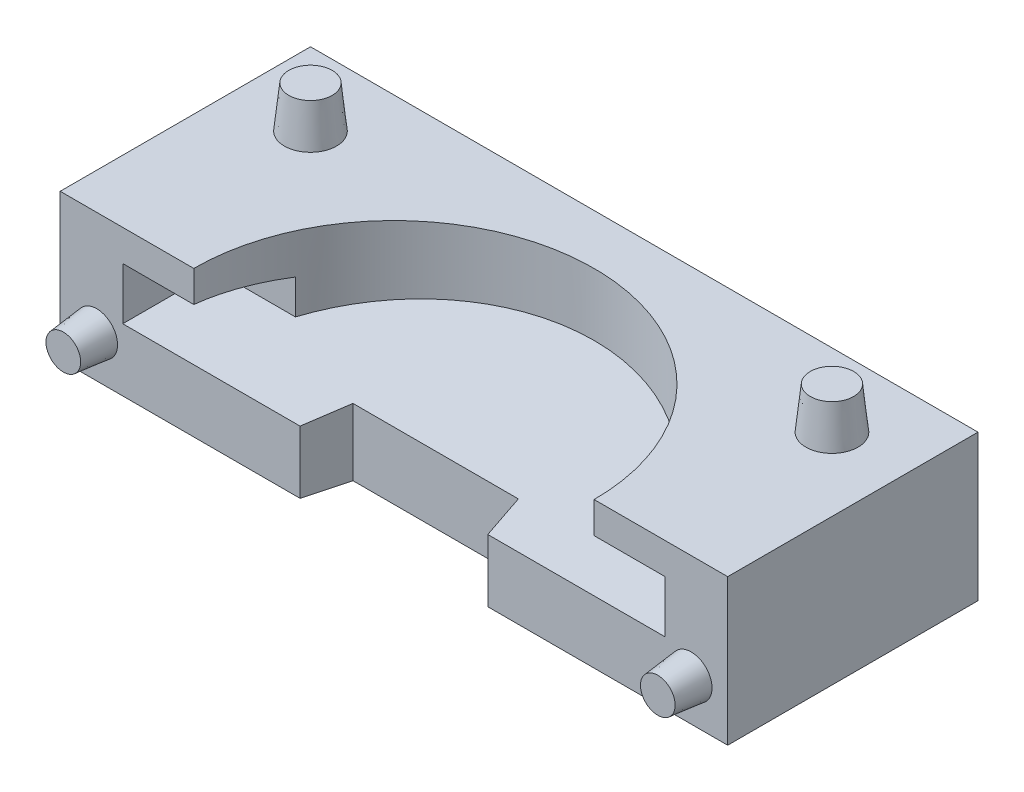
ISO-10303-21;
HEADER;
FILE_DESCRIPTION(('STEP AP214'),'2;1');
FILE_NAME('part.step','',(''),(''),'','','');
FILE_SCHEMA(('AUTOMOTIVE_DESIGN { 1 0 10303 214 1 1 1 1 }'));
ENDSEC;
DATA;
#1=APPLICATION_CONTEXT('core data for automotive mechanical design processes');
#2=APPLICATION_PROTOCOL_DEFINITION('international standard','automotive_design',2000,#1);
#3=PRODUCT_CONTEXT('',#1,'mechanical');
#4=PRODUCT('Part','Part','',(#3));
#5=PRODUCT_RELATED_PRODUCT_CATEGORY('part','',(#4));
#6=PRODUCT_DEFINITION_FORMATION('','',#4);
#7=PRODUCT_DEFINITION_CONTEXT('part definition',#1,'design');
#8=PRODUCT_DEFINITION('design','',#6,#7);
#9=PRODUCT_DEFINITION_SHAPE('','',#8);
#10=(LENGTH_UNIT() NAMED_UNIT(*) SI_UNIT(.MILLI.,.METRE.));
#11=(NAMED_UNIT(*) PLANE_ANGLE_UNIT() SI_UNIT($,.RADIAN.));
#12=(NAMED_UNIT(*) SI_UNIT($,.STERADIAN.) SOLID_ANGLE_UNIT());
#13=UNCERTAINTY_MEASURE_WITH_UNIT(LENGTH_MEASURE(1.E-05),#10,'distance_accuracy_value','');
#14=(GEOMETRIC_REPRESENTATION_CONTEXT(3) GLOBAL_UNCERTAINTY_ASSIGNED_CONTEXT((#13)) GLOBAL_UNIT_ASSIGNED_CONTEXT((#10,
#11,#12)) REPRESENTATION_CONTEXT('',''));
#15=CARTESIAN_POINT('',(0.,0.,0.));
#16=DIRECTION('',(0.,0.,1.));
#17=DIRECTION('',(1.,0.,0.));
#18=AXIS2_PLACEMENT_3D('',#15,#16,#17);
#19=CARTESIAN_POINT('',(0.,0.,0.));
#20=DIRECTION('',(0.,0.,-1.));
#21=DIRECTION('',(-1.,0.,0.));
#22=AXIS2_PLACEMENT_3D('',#19,#20,#21);
#23=PLANE('',#22);
#24=CARTESIAN_POINT('',(-142.5,-50.,0.));
#25=DIRECTION('',(0.,0.,-1.));
#26=DIRECTION('',(-1.,0.,0.));
#27=AXIS2_PLACEMENT_3D('',#24,#25,#26);
#28=CIRCLE('',#27,10.);
#29=CARTESIAN_POINT('',(-152.5,-50.,0.));
#30=VERTEX_POINT('',#29);
#31=EDGE_CURVE('E316',#30,#30,#28,.F.);
#32=ORIENTED_EDGE('',*,*,#31,.F.);
#33=EDGE_LOOP('',(#32));
#34=FACE_BOUND('',#33,.T.);
#35=DIRECTION('',(1.,0.,0.));
#36=VECTOR('',#35,1.);
#37=CARTESIAN_POINT('',(-160.,-70.,0.));
#38=LINE('',#37,#36);
#39=CARTESIAN_POINT('',(-160.,-70.,0.));
#40=VERTEX_POINT('',#39);
#41=CARTESIAN_POINT('',(-45.,-70.,0.));
#42=VERTEX_POINT('',#41);
#43=EDGE_CURVE('E261',#40,#42,#38,.T.);
#44=ORIENTED_EDGE('',*,*,#43,.T.);
#45=DIRECTION('',(0.,-1.,0.));
#46=VECTOR('',#45,1.);
#47=CARTESIAN_POINT('',(-45.,-35.7958305893729,0.));
#48=LINE('',#47,#46);
#49=CARTESIAN_POINT('',(-45.,-40.,0.));
#50=VERTEX_POINT('',#49);
#51=EDGE_CURVE('E177',#50,#42,#48,.T.);
#52=ORIENTED_EDGE('',*,*,#51,.F.);
#53=DIRECTION('',(1.,0.,0.));
#54=VECTOR('',#53,1.);
#55=CARTESIAN_POINT('',(-130.,-40.,0.));
#56=LINE('',#55,#54);
#57=CARTESIAN_POINT('',(-130.,-40.,0.));
#58=VERTEX_POINT('',#57);
#59=EDGE_CURVE('E304',#50,#58,#56,.F.);
#60=ORIENTED_EDGE('',*,*,#59,.T.);
#61=DIRECTION('',(0.,-1.,0.));
#62=VECTOR('',#61,1.);
#63=CARTESIAN_POINT('',(-130.,-15.,0.));
#64=LINE('',#63,#62);
#65=CARTESIAN_POINT('',(-130.,-15.,0.));
#66=VERTEX_POINT('',#65);
#67=EDGE_CURVE('E287',#66,#58,#64,.T.);
#68=ORIENTED_EDGE('',*,*,#67,.F.);
#69=DIRECTION('',(-1.,0.,0.));
#70=VECTOR('',#69,1.);
#71=CARTESIAN_POINT('',(-130.,-15.,0.));
#72=LINE('',#71,#70);
#73=CARTESIAN_POINT('',(-95.959595959596,-15.,0.));
#74=VERTEX_POINT('',#73);
#75=EDGE_CURVE('E284',#74,#66,#72,.T.);
#76=ORIENTED_EDGE('',*,*,#75,.F.);
#77=DIRECTION('',(0.,1.,0.));
#78=VECTOR('',#77,1.);
#79=CARTESIAN_POINT('',(-95.959595959596,-351.414724091806,0.));
#80=LINE('',#79,#78);
#81=CARTESIAN_POINT('',(-95.959595959596,0.,0.));
#82=VERTEX_POINT('',#81);
#83=EDGE_CURVE('E240',#74,#82,#80,.T.);
#84=ORIENTED_EDGE('',*,*,#83,.T.);
#85=DIRECTION('',(-1.,0.,0.));
#86=VECTOR('',#85,1.);
#87=CARTESIAN_POINT('',(-160.,0.,0.));
#88=LINE('',#87,#86);
#89=CARTESIAN_POINT('',(-160.,0.,0.));
#90=VERTEX_POINT('',#89);
#91=EDGE_CURVE('E243',#82,#90,#88,.T.);
#92=ORIENTED_EDGE('',*,*,#91,.T.);
#93=DIRECTION('',(0.,-1.,0.));
#94=VECTOR('',#93,1.);
#95=CARTESIAN_POINT('',(-160.,-70.,0.));
#96=LINE('',#95,#94);
#97=EDGE_CURVE('E264',#90,#40,#96,.T.);
#98=ORIENTED_EDGE('',*,*,#97,.T.);
#99=EDGE_LOOP('',(#44,#52,#60,#68,#76,#84,#92,#98));
#100=FACE_BOUND('',#99,.T.);
#101=ADVANCED_FACE('F37',(#34,#100),#23,.F.);
#102=CARTESIAN_POINT('',(-160.,0.,-120.));
#103=DIRECTION('',(0.,1.,0.));
#104=DIRECTION('',(-1.,0.,0.));
#105=AXIS2_PLACEMENT_3D('',#102,#103,#104);
#106=PLANE('',#105);
#107=CARTESIAN_POINT('',(125.,0.,-85.));
#108=DIRECTION('',(0.,1.,0.));
#109=DIRECTION('',(-1.,0.,0.));
#110=AXIS2_PLACEMENT_3D('',#107,#108,#109);
#111=CIRCLE('',#110,12.5);
#112=CARTESIAN_POINT('',(112.5,0.,-85.));
#113=VERTEX_POINT('',#112);
#114=EDGE_CURVE('E216',#113,#113,#111,.T.);
#115=ORIENTED_EDGE('',*,*,#114,.F.);
#116=EDGE_LOOP('',(#115));
#117=FACE_BOUND('',#116,.T.);
#118=CARTESIAN_POINT('',(-125.,0.,-85.));
#119=DIRECTION('',(0.,1.,0.));
#120=DIRECTION('',(-1.,0.,0.));
#121=AXIS2_PLACEMENT_3D('',#118,#119,#120);
#122=CIRCLE('',#121,12.5);
#123=CARTESIAN_POINT('',(-137.5,0.,-85.));
#124=VERTEX_POINT('',#123);
#125=EDGE_CURVE('E222',#124,#124,#122,.T.);
#126=ORIENTED_EDGE('',*,*,#125,.F.);
#127=EDGE_LOOP('',(#126));
#128=FACE_BOUND('',#127,.T.);
#129=CARTESIAN_POINT('',(0.,0.,0.));
#130=DIRECTION('',(0.,1.,0.));
#131=DIRECTION('',(0.,0.,1.));
#132=AXIS2_PLACEMENT_3D('',#129,#130,#131);
#133=CIRCLE('',#132,95.959595959596);
#134=CARTESIAN_POINT('',(95.959595959596,0.,0.));
#135=VERTEX_POINT('',#134);
#136=EDGE_CURVE('E307',#135,#82,#133,.T.);
#137=ORIENTED_EDGE('',*,*,#136,.F.);
#138=CARTESIAN_POINT('',(160.,0.,0.));
#139=VERTEX_POINT('',#138);
#140=EDGE_CURVE('E239',#139,#135,#88,.T.);
#141=ORIENTED_EDGE('',*,*,#140,.F.);
#142=DIRECTION('',(0.,0.,1.));
#143=VECTOR('',#142,1.);
#144=CARTESIAN_POINT('',(160.,0.,-120.));
#145=LINE('',#144,#143);
#146=CARTESIAN_POINT('',(160.,0.,-120.));
#147=VERTEX_POINT('',#146);
#148=EDGE_CURVE('E253',#147,#139,#145,.T.);
#149=ORIENTED_EDGE('',*,*,#148,.F.);
#150=DIRECTION('',(-1.,0.,0.));
#151=VECTOR('',#150,1.);
#152=CARTESIAN_POINT('',(-160.,0.,-120.));
#153=LINE('',#152,#151);
#154=CARTESIAN_POINT('',(-160.,0.,-120.));
#155=VERTEX_POINT('',#154);
#156=EDGE_CURVE('E234',#147,#155,#153,.T.);
#157=ORIENTED_EDGE('',*,*,#156,.T.);
#158=DIRECTION('',(0.,0.,1.));
#159=VECTOR('',#158,1.);
#160=CARTESIAN_POINT('',(-160.,0.,-120.));
#161=LINE('',#160,#159);
#162=EDGE_CURVE('E255',#155,#90,#161,.T.);
#163=ORIENTED_EDGE('',*,*,#162,.T.);
#164=ORIENTED_EDGE('',*,*,#91,.F.);
#165=EDGE_LOOP('',(#137,#141,#149,#157,#163,#164));
#166=FACE_BOUND('',#165,.T.);
#167=ADVANCED_FACE('F39',(#117,#128,#166),#106,.T.);
#168=CARTESIAN_POINT('',(142.5,-50.,0.));
#169=DIRECTION('',(0.,0.,-1.));
#170=DIRECTION('',(-1.,0.,0.));
#171=AXIS2_PLACEMENT_3D('',#168,#169,#170);
#172=CIRCLE('',#171,10.);
#173=CARTESIAN_POINT('',(132.5,-50.,0.));
#174=VERTEX_POINT('',#173);
#175=EDGE_CURVE('E328',#174,#174,#172,.F.);
#176=ORIENTED_EDGE('',*,*,#175,.F.);
#177=EDGE_LOOP('',(#176));
#178=FACE_BOUND('',#177,.T.);
#179=CARTESIAN_POINT('',(130.,-40.,0.));
#180=VERTEX_POINT('',#179);
#181=CARTESIAN_POINT('',(45.,-40.,0.));
#182=VERTEX_POINT('',#181);
#183=EDGE_CURVE('E244',#180,#182,#56,.F.);
#184=ORIENTED_EDGE('',*,*,#183,.T.);
#185=DIRECTION('',(0.,-1.,0.));
#186=VECTOR('',#185,1.);
#187=CARTESIAN_POINT('',(45.,-35.7958305893729,0.));
#188=LINE('',#187,#186);
#189=CARTESIAN_POINT('',(45.,-70.,0.));
#190=VERTEX_POINT('',#189);
#191=EDGE_CURVE('E189',#182,#190,#188,.T.);
#192=ORIENTED_EDGE('',*,*,#191,.T.);
#193=CARTESIAN_POINT('',(160.,-70.,0.));
#194=VERTEX_POINT('',#193);
#195=EDGE_CURVE('E263',#190,#194,#38,.T.);
#196=ORIENTED_EDGE('',*,*,#195,.T.);
#197=DIRECTION('',(0.,1.,0.));
#198=VECTOR('',#197,1.);
#199=CARTESIAN_POINT('',(160.,-70.,0.));
#200=LINE('',#199,#198);
#201=EDGE_CURVE('E258',#194,#139,#200,.T.);
#202=ORIENTED_EDGE('',*,*,#201,.T.);
#203=ORIENTED_EDGE('',*,*,#140,.T.);
#204=DIRECTION('',(0.,1.,0.));
#205=VECTOR('',#204,1.);
#206=CARTESIAN_POINT('',(95.959595959596,-351.414724091806,0.));
#207=LINE('',#206,#205);
#208=CARTESIAN_POINT('',(95.959595959596,-15.,0.));
#209=VERTEX_POINT('',#208);
#210=EDGE_CURVE('E235',#135,#209,#207,.F.);
#211=ORIENTED_EDGE('',*,*,#210,.T.);
#212=DIRECTION('',(-1.,0.,0.));
#213=VECTOR('',#212,1.);
#214=CARTESIAN_POINT('',(-130.,-15.,0.));
#215=LINE('',#214,#213);
#216=CARTESIAN_POINT('',(130.,-15.,0.));
#217=VERTEX_POINT('',#216);
#218=EDGE_CURVE('E300',#217,#209,#215,.T.);
#219=ORIENTED_EDGE('',*,*,#218,.F.);
#220=DIRECTION('',(0.,-1.,0.));
#221=VECTOR('',#220,1.);
#222=CARTESIAN_POINT('',(130.,-15.,0.));
#223=LINE('',#222,#221);
#224=EDGE_CURVE('E238',#217,#180,#223,.T.);
#225=ORIENTED_EDGE('',*,*,#224,.T.);
#226=EDGE_LOOP('',(#184,#192,#196,#202,#203,#211,#219,#225));
#227=FACE_BOUND('',#226,.T.);
#228=ADVANCED_FACE('F357',(#178,#227),#23,.F.);
#229=CARTESIAN_POINT('',(-160.,-70.,-120.));
#230=DIRECTION('',(-1.,0.,0.));
#231=DIRECTION('',(0.,0.,1.));
#232=AXIS2_PLACEMENT_3D('',#229,#230,#231);
#233=PLANE('',#232);
#234=ORIENTED_EDGE('',*,*,#97,.F.);
#235=ORIENTED_EDGE('',*,*,#162,.F.);
#236=DIRECTION('',(0.,-1.,0.));
#237=VECTOR('',#236,1.);
#238=CARTESIAN_POINT('',(-160.,-70.,-120.));
#239=LINE('',#238,#237);
#240=CARTESIAN_POINT('',(-160.,-70.,-120.));
#241=VERTEX_POINT('',#240);
#242=EDGE_CURVE('E248',#155,#241,#239,.T.);
#243=ORIENTED_EDGE('',*,*,#242,.T.);
#244=DIRECTION('',(0.,0.,1.));
#245=VECTOR('',#244,1.);
#246=CARTESIAN_POINT('',(-160.,-70.,-120.));
#247=LINE('',#246,#245);
#248=EDGE_CURVE('E245',#241,#40,#247,.T.);
#249=ORIENTED_EDGE('',*,*,#248,.T.);
#250=EDGE_LOOP('',(#234,#235,#243,#249));
#251=FACE_BOUND('',#250,.T.);
#252=ADVANCED_FACE('F348',(#251),#233,.T.);
#253=CARTESIAN_POINT('',(160.,-70.,-120.));
#254=DIRECTION('',(1.,0.,0.));
#255=DIRECTION('',(0.,0.,-1.));
#256=AXIS2_PLACEMENT_3D('',#253,#254,#255);
#257=PLANE('',#256);
#258=ORIENTED_EDGE('',*,*,#201,.F.);
#259=DIRECTION('',(0.,0.,1.));
#260=VECTOR('',#259,1.);
#261=CARTESIAN_POINT('',(160.,-70.,-120.));
#262=LINE('',#261,#260);
#263=CARTESIAN_POINT('',(160.,-70.,-120.));
#264=VERTEX_POINT('',#263);
#265=EDGE_CURVE('E249',#264,#194,#262,.T.);
#266=ORIENTED_EDGE('',*,*,#265,.F.);
#267=DIRECTION('',(0.,1.,0.));
#268=VECTOR('',#267,1.);
#269=CARTESIAN_POINT('',(160.,-70.,-120.));
#270=LINE('',#269,#268);
#271=EDGE_CURVE('E247',#264,#147,#270,.T.);
#272=ORIENTED_EDGE('',*,*,#271,.T.);
#273=ORIENTED_EDGE('',*,*,#148,.T.);
#274=EDGE_LOOP('',(#258,#266,#272,#273));
#275=FACE_BOUND('',#274,.T.);
#276=ADVANCED_FACE('F355',(#275),#257,.T.);
#277=CARTESIAN_POINT('',(-160.,-70.,-120.));
#278=DIRECTION('',(0.,-1.,0.));
#279=DIRECTION('',(1.,0.,0.));
#280=AXIS2_PLACEMENT_3D('',#277,#278,#279);
#281=PLANE('',#280);
#282=DIRECTION('',(0.258819045102514,0.,-0.96592582628907));
#283=VECTOR('',#282,1.);
#284=CARTESIAN_POINT('',(-39.6410161513777,-70.,-20.));
#285=LINE('',#284,#283);
#286=CARTESIAN_POINT('',(-39.6410161513777,-70.,-20.));
#287=VERTEX_POINT('',#286);
#288=EDGE_CURVE('E174',#42,#287,#285,.T.);
#289=ORIENTED_EDGE('',*,*,#288,.F.);
#290=ORIENTED_EDGE('',*,*,#43,.F.);
#291=ORIENTED_EDGE('',*,*,#248,.F.);
#292=DIRECTION('',(1.,0.,0.));
#293=VECTOR('',#292,1.);
#294=CARTESIAN_POINT('',(-160.,-70.,-120.));
#295=LINE('',#294,#293);
#296=EDGE_CURVE('E252',#241,#264,#295,.T.);
#297=ORIENTED_EDGE('',*,*,#296,.T.);
#298=ORIENTED_EDGE('',*,*,#265,.T.);
#299=ORIENTED_EDGE('',*,*,#195,.F.);
#300=DIRECTION('',(0.258819045102514,0.,0.96592582628907));
#301=VECTOR('',#300,1.);
#302=CARTESIAN_POINT('',(45.,-70.,0.));
#303=LINE('',#302,#301);
#304=CARTESIAN_POINT('',(39.6410161513777,-70.,-20.));
#305=VERTEX_POINT('',#304);
#306=EDGE_CURVE('E171',#305,#190,#303,.T.);
#307=ORIENTED_EDGE('',*,*,#306,.F.);
#308=DIRECTION('',(1.,0.,0.));
#309=VECTOR('',#308,1.);
#310=CARTESIAN_POINT('',(39.6410161513777,-70.,-20.));
#311=LINE('',#310,#309);
#312=EDGE_CURVE('E165',#287,#305,#311,.T.);
#313=ORIENTED_EDGE('',*,*,#312,.F.);
#314=EDGE_LOOP('',(#289,#290,#291,#297,#298,#299,#307,#313));
#315=FACE_BOUND('',#314,.T.);
#316=ADVANCED_FACE('F182',(#315),#281,.T.);
#317=CARTESIAN_POINT('',(0.,0.,-120.));
#318=DIRECTION('',(0.,0.,-1.));
#319=DIRECTION('',(-1.,0.,0.));
#320=AXIS2_PLACEMENT_3D('',#317,#318,#319);
#321=PLANE('',#320);
#322=CARTESIAN_POINT('',(112.5,-27.5,-120.));
#323=DIRECTION('',(0.,0.,1.));
#324=DIRECTION('',(1.,0.,0.));
#325=AXIS2_PLACEMENT_3D('',#322,#323,#324);
#326=CIRCLE('',#325,3.74999999999998);
#327=CARTESIAN_POINT('',(116.25,-27.5,-120.));
#328=VERTEX_POINT('',#327);
#329=EDGE_CURVE('E201',#328,#328,#326,.T.);
#330=ORIENTED_EDGE('',*,*,#329,.T.);
#331=EDGE_LOOP('',(#330));
#332=FACE_BOUND('',#331,.T.);
#333=CARTESIAN_POINT('',(-112.5,-27.5,-120.));
#334=DIRECTION('',(0.,0.,1.));
#335=DIRECTION('',(1.,0.,0.));
#336=AXIS2_PLACEMENT_3D('',#333,#334,#335);
#337=CIRCLE('',#336,3.74999999999998);
#338=CARTESIAN_POINT('',(-108.75,-27.5,-120.));
#339=VERTEX_POINT('',#338);
#340=EDGE_CURVE('E213',#339,#339,#337,.T.);
#341=ORIENTED_EDGE('',*,*,#340,.T.);
#342=EDGE_LOOP('',(#341));
#343=FACE_BOUND('',#342,.T.);
#344=ORIENTED_EDGE('',*,*,#242,.F.);
#345=ORIENTED_EDGE('',*,*,#156,.F.);
#346=ORIENTED_EDGE('',*,*,#271,.F.);
#347=ORIENTED_EDGE('',*,*,#296,.F.);
#348=EDGE_LOOP('',(#344,#345,#346,#347));
#349=FACE_BOUND('',#348,.T.);
#350=ADVANCED_FACE('F346',(#332,#343,#349),#321,.T.);
#351=CARTESIAN_POINT('',(125.795830589373,-15.,-40.));
#352=DIRECTION('',(0.,0.,-1.));
#353=DIRECTION('',(-1.,0.,0.));
#354=AXIS2_PLACEMENT_3D('',#351,#352,#353);
#355=PLANE('',#354);
#356=CARTESIAN_POINT('',(112.5,-27.5,-40.));
#357=DIRECTION('',(0.,0.,1.));
#358=DIRECTION('',(1.,0.,0.));
#359=AXIS2_PLACEMENT_3D('',#356,#357,#358);
#360=CIRCLE('',#359,5.);
#361=CARTESIAN_POINT('',(117.5,-27.5,-40.));
#362=VERTEX_POINT('',#361);
#363=EDGE_CURVE('E188',#362,#362,#360,.T.);
#364=ORIENTED_EDGE('',*,*,#363,.F.);
#365=EDGE_LOOP('',(#364));
#366=FACE_BOUND('',#365,.T.);
#367=DIRECTION('',(-1.,0.,0.));
#368=VECTOR('',#367,1.);
#369=CARTESIAN_POINT('',(125.795830589373,-35.7958305893729,-40.));
#370=LINE('',#369,#368);
#371=CARTESIAN_POINT('',(87.2252489634103,-35.7958305893729,-40.));
#372=VERTEX_POINT('',#371);
#373=CARTESIAN_POINT('',(125.795830589373,-35.7958305893729,-40.));
#374=VERTEX_POINT('',#373);
#375=EDGE_CURVE('E61',#372,#374,#370,.F.);
#376=ORIENTED_EDGE('',*,*,#375,.T.);
#377=DIRECTION('',(0.,-1.,0.));
#378=VECTOR('',#377,1.);
#379=CARTESIAN_POINT('',(125.795830589373,-15.,-40.));
#380=LINE('',#379,#378);
#381=CARTESIAN_POINT('',(125.795830589373,-19.2041694106271,-40.));
#382=VERTEX_POINT('',#381);
#383=EDGE_CURVE('E291',#382,#374,#380,.T.);
#384=ORIENTED_EDGE('',*,*,#383,.F.);
#385=DIRECTION('',(1.,0.,0.));
#386=VECTOR('',#385,1.);
#387=CARTESIAN_POINT('',(125.795830589373,-19.2041694106271,-40.));
#388=LINE('',#387,#386);
#389=CARTESIAN_POINT('',(87.2252489634103,-19.2041694106271,-40.));
#390=VERTEX_POINT('',#389);
#391=EDGE_CURVE('E94',#390,#382,#388,.T.);
#392=ORIENTED_EDGE('',*,*,#391,.F.);
#393=DIRECTION('',(0.,1.,0.));
#394=VECTOR('',#393,1.);
#395=CARTESIAN_POINT('',(87.2252489634103,-351.414724091806,-40.));
#396=LINE('',#395,#394);
#397=EDGE_CURVE('E296',#372,#390,#396,.T.);
#398=ORIENTED_EDGE('',*,*,#397,.F.);
#399=EDGE_LOOP('',(#376,#384,#392,#398));
#400=FACE_BOUND('',#399,.T.);
#401=ADVANCED_FACE('F363',(#366,#400),#355,.F.);
#402=CARTESIAN_POINT('',(-112.5,-27.5,-40.));
#403=DIRECTION('',(0.,0.,1.));
#404=DIRECTION('',(1.,0.,0.));
#405=AXIS2_PLACEMENT_3D('',#402,#403,#404);
#406=CIRCLE('',#405,5.);
#407=CARTESIAN_POINT('',(-107.5,-27.5,-40.));
#408=VERTEX_POINT('',#407);
#409=EDGE_CURVE('E204',#408,#408,#406,.T.);
#410=ORIENTED_EDGE('',*,*,#409,.F.);
#411=EDGE_LOOP('',(#410));
#412=FACE_BOUND('',#411,.T.);
#413=DIRECTION('',(1.,0.,0.));
#414=VECTOR('',#413,1.);
#415=CARTESIAN_POINT('',(125.795830589373,-19.2041694106271,-40.));
#416=LINE('',#415,#414);
#417=CARTESIAN_POINT('',(-125.795830589373,-19.2041694106271,-40.));
#418=VERTEX_POINT('',#417);
#419=CARTESIAN_POINT('',(-87.2252489634103,-19.2041694106271,-40.));
#420=VERTEX_POINT('',#419);
#421=EDGE_CURVE('E278',#418,#420,#416,.T.);
#422=ORIENTED_EDGE('',*,*,#421,.F.);
#423=DIRECTION('',(0.,-1.,0.));
#424=VECTOR('',#423,1.);
#425=CARTESIAN_POINT('',(-125.795830589373,-15.,-40.));
#426=LINE('',#425,#424);
#427=CARTESIAN_POINT('',(-125.795830589373,-35.7958305893729,-40.));
#428=VERTEX_POINT('',#427);
#429=EDGE_CURVE('E105',#418,#428,#426,.T.);
#430=ORIENTED_EDGE('',*,*,#429,.T.);
#431=DIRECTION('',(-1.,0.,0.));
#432=VECTOR('',#431,1.);
#433=CARTESIAN_POINT('',(125.795830589373,-35.7958305893729,-40.));
#434=LINE('',#433,#432);
#435=CARTESIAN_POINT('',(-87.2252489634103,-35.7958305893729,-40.));
#436=VERTEX_POINT('',#435);
#437=EDGE_CURVE('E101',#428,#436,#434,.F.);
#438=ORIENTED_EDGE('',*,*,#437,.T.);
#439=DIRECTION('',(0.,1.,0.));
#440=VECTOR('',#439,1.);
#441=CARTESIAN_POINT('',(-87.2252489634103,-351.414724091806,-40.));
#442=LINE('',#441,#440);
#443=EDGE_CURVE('E277',#420,#436,#442,.F.);
#444=ORIENTED_EDGE('',*,*,#443,.F.);
#445=EDGE_LOOP('',(#422,#430,#438,#444));
#446=FACE_BOUND('',#445,.T.);
#447=ADVANCED_FACE('F374',(#412,#446),#355,.F.);
#448=CARTESIAN_POINT('',(-130.,-15.,0.));
#449=DIRECTION('',(0.,0.994521895368273,-0.104528463267654));
#450=DIRECTION('',(0.,0.104528463267654,0.994521895368273));
#451=AXIS2_PLACEMENT_3D('',#448,#449,#450);
#452=PLANE('',#451);
#453=ORIENTED_EDGE('',*,*,#391,.T.);
#454=DIRECTION('',(0.103962051184499,0.103962051184498,0.989132844377854));
#455=VECTOR('',#454,1.);
#456=CARTESIAN_POINT('',(130.,-15.,0.));
#457=LINE('',#456,#455);
#458=EDGE_CURVE('E310',#382,#217,#457,.T.);
#459=ORIENTED_EDGE('',*,*,#458,.T.);
#460=ORIENTED_EDGE('',*,*,#218,.T.);
#461=CARTESIAN_POINT('',(0.,-15.,0.));
#462=DIRECTION('',(0.,0.994521895368273,-0.104528463267654));
#463=DIRECTION('',(0.,0.104528463267654,0.994521895368273));
#464=AXIS2_PLACEMENT_3D('',#461,#462,#463);
#465=ELLIPSE('',#464,96.4881682409435,95.959595959596);
#466=EDGE_CURVE('E305',#390,#209,#465,.F.);
#467=ORIENTED_EDGE('',*,*,#466,.F.);
#468=EDGE_LOOP('',(#453,#459,#460,#467));
#469=FACE_BOUND('',#468,.T.);
#470=ADVANCED_FACE('F372',(#469),#452,.F.);
#471=CARTESIAN_POINT('',(130.,-15.,0.));
#472=DIRECTION('',(0.994521895368273,0.,-0.104528463267654));
#473=DIRECTION('',(-0.104528463267654,0.,-0.994521895368273));
#474=AXIS2_PLACEMENT_3D('',#471,#472,#473);
#475=PLANE('',#474);
#476=DIRECTION('',(-0.103962051184499,0.103962051184498,-0.989132844377854));
#477=VECTOR('',#476,1.);
#478=CARTESIAN_POINT('',(129.729797297838,-39.7297972978378,-2.57080698488696));
#479=LINE('',#478,#477);
#480=EDGE_CURVE('E298',#374,#180,#479,.F.);
#481=ORIENTED_EDGE('',*,*,#480,.T.);
#482=ORIENTED_EDGE('',*,*,#224,.F.);
#483=ORIENTED_EDGE('',*,*,#458,.F.);
#484=ORIENTED_EDGE('',*,*,#383,.T.);
#485=EDGE_LOOP('',(#481,#482,#483,#484));
#486=FACE_BOUND('',#485,.T.);
#487=ADVANCED_FACE('F360',(#486),#475,.F.);
#488=CARTESIAN_POINT('',(-130.,-15.,0.));
#489=DIRECTION('',(-0.994521895368273,0.,-0.104528463267654));
#490=DIRECTION('',(-0.104528463267654,0.,0.994521895368273));
#491=AXIS2_PLACEMENT_3D('',#488,#489,#490);
#492=PLANE('',#491);
#493=DIRECTION('',(-0.103962051184498,-0.103962051184498,0.989132844377854));
#494=VECTOR('',#493,1.);
#495=CARTESIAN_POINT('',(-129.729797297838,-39.7297972978378,-2.57080698488696));
#496=LINE('',#495,#494);
#497=EDGE_CURVE('E288',#58,#428,#496,.F.);
#498=ORIENTED_EDGE('',*,*,#497,.T.);
#499=ORIENTED_EDGE('',*,*,#429,.F.);
#500=DIRECTION('',(0.103962051184498,-0.103962051184498,-0.989132844377854));
#501=VECTOR('',#500,1.);
#502=CARTESIAN_POINT('',(-130.,-15.,0.));
#503=LINE('',#502,#501);
#504=EDGE_CURVE('E281',#66,#418,#503,.T.);
#505=ORIENTED_EDGE('',*,*,#504,.F.);
#506=ORIENTED_EDGE('',*,*,#67,.T.);
#507=EDGE_LOOP('',(#498,#499,#505,#506));
#508=FACE_BOUND('',#507,.T.);
#509=ADVANCED_FACE('F367',(#508),#492,.F.);
#510=ORIENTED_EDGE('',*,*,#75,.T.);
#511=ORIENTED_EDGE('',*,*,#504,.T.);
#512=ORIENTED_EDGE('',*,*,#421,.T.);
#513=CARTESIAN_POINT('',(0.,-15.,0.));
#514=DIRECTION('',(0.,0.994521895368273,-0.104528463267654));
#515=DIRECTION('',(0.,0.104528463267654,0.994521895368273));
#516=AXIS2_PLACEMENT_3D('',#513,#514,#515);
#517=ELLIPSE('',#516,96.4881682409435,95.959595959596);
#518=EDGE_CURVE('E275',#74,#420,#517,.F.);
#519=ORIENTED_EDGE('',*,*,#518,.F.);
#520=EDGE_LOOP('',(#510,#511,#512,#519));
#521=FACE_BOUND('',#520,.T.);
#522=ADVANCED_FACE('F371',(#521),#452,.F.);
#523=CARTESIAN_POINT('',(0.,-351.414724091806,0.));
#524=DIRECTION('',(0.,1.,0.));
#525=DIRECTION('',(0.,0.,1.));
#526=AXIS2_PLACEMENT_3D('',#523,#524,#525);
#527=CYLINDRICAL_SURFACE('',#526,95.959595959596);
#528=ORIENTED_EDGE('',*,*,#518,.T.);
#529=ORIENTED_EDGE('',*,*,#443,.T.);
#530=CARTESIAN_POINT('',(0.,-40.,0.));
#531=DIRECTION('',(0.,-0.994521895368273,-0.104528463267654));
#532=DIRECTION('',(0.,0.104528463267654,-0.994521895368273));
#533=AXIS2_PLACEMENT_3D('',#530,#531,#532);
#534=ELLIPSE('',#533,96.4881682409435,95.959595959596);
#535=EDGE_CURVE('E293',#436,#372,#534,.T.);
#536=ORIENTED_EDGE('',*,*,#535,.T.);
#537=ORIENTED_EDGE('',*,*,#397,.T.);
#538=ORIENTED_EDGE('',*,*,#466,.T.);
#539=ORIENTED_EDGE('',*,*,#210,.F.);
#540=ORIENTED_EDGE('',*,*,#136,.T.);
#541=ORIENTED_EDGE('',*,*,#83,.F.);
#542=EDGE_LOOP('',(#528,#529,#536,#537,#538,#539,#540,#541));
#543=FACE_BOUND('',#542,.T.);
#544=ADVANCED_FACE('F365',(#543),#527,.F.);
#545=CARTESIAN_POINT('',(-130.,-40.,0.));
#546=DIRECTION('',(0.,-0.994521895368273,-0.104528463267654));
#547=DIRECTION('',(0.,0.104528463267654,-0.994521895368273));
#548=AXIS2_PLACEMENT_3D('',#545,#546,#547);
#549=PLANE('',#548);
#550=DIRECTION('',(0.257495457140397,0.10100371216489,-0.96098612876616));
#551=VECTOR('',#550,1.);
#552=CARTESIAN_POINT('',(-50.6358323880751,-42.2106797481259,21.0332128152389));
#553=LINE('',#552,#551);
#554=CARTESIAN_POINT('',(-39.6410161513777,-37.8979152946865,-20.));
#555=VERTEX_POINT('',#554);
#556=EDGE_CURVE('E11',#555,#50,#553,.F.);
#557=ORIENTED_EDGE('',*,*,#556,.F.);
#558=DIRECTION('',(1.,0.,0.));
#559=VECTOR('',#558,1.);
#560=CARTESIAN_POINT('',(-130.,-37.8979152946865,-20.));
#561=LINE('',#560,#559);
#562=CARTESIAN_POINT('',(39.6410161513777,-37.8979152946865,-20.));
#563=VERTEX_POINT('',#562);
#564=EDGE_CURVE('E168',#563,#555,#561,.F.);
#565=ORIENTED_EDGE('',*,*,#564,.F.);
#566=DIRECTION('',(0.257495457140397,-0.10100371216489,0.96098612876616));
#567=VECTOR('',#566,1.);
#568=CARTESIAN_POINT('',(33.3968156716102,-35.4486005185643,-43.3036734431389));
#569=LINE('',#568,#567);
#570=EDGE_CURVE('E45',#182,#563,#569,.F.);
#571=ORIENTED_EDGE('',*,*,#570,.F.);
#572=ORIENTED_EDGE('',*,*,#183,.F.);
#573=ORIENTED_EDGE('',*,*,#480,.F.);
#574=ORIENTED_EDGE('',*,*,#375,.F.);
#575=ORIENTED_EDGE('',*,*,#535,.F.);
#576=ORIENTED_EDGE('',*,*,#437,.F.);
#577=ORIENTED_EDGE('',*,*,#497,.F.);
#578=ORIENTED_EDGE('',*,*,#59,.F.);
#579=EDGE_LOOP('',(#557,#565,#571,#572,#573,#574,#575,#576,#577,#578));
#580=FACE_BOUND('',#579,.T.);
#581=ADVANCED_FACE('F335',(#580),#549,.F.);
#582=CARTESIAN_POINT('',(-142.5,-50.,0.));
#583=DIRECTION('',(0.,0.,-1.));
#584=DIRECTION('',(1.,0.,0.));
#585=AXIS2_PLACEMENT_3D('',#582,#583,#584);
#586=CONICAL_SURFACE('',#585,10.,0.10471975511966);
#587=CARTESIAN_POINT('',(-142.5,-50.,16.));
#588=DIRECTION('',(0.,0.,1.));
#589=DIRECTION('',(1.,0.,0.));
#590=AXIS2_PLACEMENT_3D('',#587,#588,#589);
#591=CIRCLE('',#590,8.31833223574918);
#592=CARTESIAN_POINT('',(-134.181667764251,-50.,16.));
#593=VERTEX_POINT('',#592);
#594=EDGE_CURVE('E231',#593,#593,#591,.T.);
#595=ORIENTED_EDGE('',*,*,#594,.F.);
#596=EDGE_LOOP('',(#595));
#597=FACE_BOUND('',#596,.T.);
#598=ORIENTED_EDGE('',*,*,#31,.T.);
#599=EDGE_LOOP('',(#598));
#600=FACE_BOUND('',#599,.T.);
#601=ADVANCED_FACE('F414',(#597,#600),#586,.T.);
#602=CARTESIAN_POINT('',(-142.5,-50.,16.));
#603=DIRECTION('',(0.,0.,1.));
#604=DIRECTION('',(1.,0.,0.));
#605=AXIS2_PLACEMENT_3D('',#602,#603,#604);
#606=PLANE('',#605);
#607=ORIENTED_EDGE('',*,*,#594,.T.);
#608=EDGE_LOOP('',(#607));
#609=FACE_BOUND('',#608,.T.);
#610=ADVANCED_FACE('F404',(#609),#606,.T.);
#611=CARTESIAN_POINT('',(142.5,-50.,0.));
#612=DIRECTION('',(0.,0.,-1.));
#613=DIRECTION('',(1.,0.,0.));
#614=AXIS2_PLACEMENT_3D('',#611,#612,#613);
#615=CONICAL_SURFACE('',#614,10.,0.10471975511966);
#616=CARTESIAN_POINT('',(142.5,-50.,16.));
#617=DIRECTION('',(0.,0.,1.));
#618=DIRECTION('',(1.,0.,0.));
#619=AXIS2_PLACEMENT_3D('',#616,#617,#618);
#620=CIRCLE('',#619,8.31833223574918);
#621=CARTESIAN_POINT('',(150.818332235749,-50.,16.));
#622=VERTEX_POINT('',#621);
#623=EDGE_CURVE('E228',#622,#622,#620,.T.);
#624=ORIENTED_EDGE('',*,*,#623,.F.);
#625=EDGE_LOOP('',(#624));
#626=FACE_BOUND('',#625,.T.);
#627=ORIENTED_EDGE('',*,*,#175,.T.);
#628=EDGE_LOOP('',(#627));
#629=FACE_BOUND('',#628,.T.);
#630=ADVANCED_FACE('F401',(#626,#629),#615,.T.);
#631=CARTESIAN_POINT('',(142.5,-50.,16.));
#632=DIRECTION('',(0.,0.,1.));
#633=DIRECTION('',(1.,0.,0.));
#634=AXIS2_PLACEMENT_3D('',#631,#632,#633);
#635=PLANE('',#634);
#636=ORIENTED_EDGE('',*,*,#623,.T.);
#637=EDGE_LOOP('',(#636));
#638=FACE_BOUND('',#637,.T.);
#639=ADVANCED_FACE('F403',(#638),#635,.T.);
#640=CARTESIAN_POINT('',(-125.,0.,-85.));
#641=DIRECTION('',(0.,-1.,0.));
#642=DIRECTION('',(-1.,0.,0.));
#643=AXIS2_PLACEMENT_3D('',#640,#641,#642);
#644=CONICAL_SURFACE('',#643,12.5,0.10471975511966);
#645=CARTESIAN_POINT('',(-125.,20.,-85.));
#646=DIRECTION('',(0.,1.,0.));
#647=DIRECTION('',(-1.,0.,0.));
#648=AXIS2_PLACEMENT_3D('',#645,#646,#647);
#649=CIRCLE('',#648,10.3979152946865);
#650=CARTESIAN_POINT('',(-135.397915294686,20.,-85.));
#651=VERTEX_POINT('',#650);
#652=EDGE_CURVE('E225',#651,#651,#649,.T.);
#653=ORIENTED_EDGE('',*,*,#652,.F.);
#654=EDGE_LOOP('',(#653));
#655=FACE_BOUND('',#654,.T.);
#656=ORIENTED_EDGE('',*,*,#125,.T.);
#657=EDGE_LOOP('',(#656));
#658=FACE_BOUND('',#657,.T.);
#659=ADVANCED_FACE('F411',(#655,#658),#644,.T.);
#660=CARTESIAN_POINT('',(-125.,20.,-85.));
#661=DIRECTION('',(0.,1.,0.));
#662=DIRECTION('',(-1.,0.,0.));
#663=AXIS2_PLACEMENT_3D('',#660,#661,#662);
#664=PLANE('',#663);
#665=ORIENTED_EDGE('',*,*,#652,.T.);
#666=EDGE_LOOP('',(#665));
#667=FACE_BOUND('',#666,.T.);
#668=ADVANCED_FACE('F481',(#667),#664,.T.);
#669=CARTESIAN_POINT('',(125.,0.,-85.));
#670=DIRECTION('',(0.,-1.,0.));
#671=DIRECTION('',(-1.,0.,0.));
#672=AXIS2_PLACEMENT_3D('',#669,#670,#671);
#673=CONICAL_SURFACE('',#672,12.5,0.10471975511966);
#674=CARTESIAN_POINT('',(125.,20.,-85.));
#675=DIRECTION('',(0.,1.,0.));
#676=DIRECTION('',(-1.,0.,0.));
#677=AXIS2_PLACEMENT_3D('',#674,#675,#676);
#678=CIRCLE('',#677,10.3979152946865);
#679=CARTESIAN_POINT('',(114.602084705314,20.,-85.));
#680=VERTEX_POINT('',#679);
#681=EDGE_CURVE('E219',#680,#680,#678,.T.);
#682=ORIENTED_EDGE('',*,*,#681,.F.);
#683=EDGE_LOOP('',(#682));
#684=FACE_BOUND('',#683,.T.);
#685=ORIENTED_EDGE('',*,*,#114,.T.);
#686=EDGE_LOOP('',(#685));
#687=FACE_BOUND('',#686,.T.);
#688=ADVANCED_FACE('F477',(#684,#687),#673,.T.);
#689=CARTESIAN_POINT('',(125.,20.,-85.));
#690=DIRECTION('',(0.,1.,0.));
#691=DIRECTION('',(-1.,0.,0.));
#692=AXIS2_PLACEMENT_3D('',#689,#690,#691);
#693=PLANE('',#692);
#694=ORIENTED_EDGE('',*,*,#681,.T.);
#695=EDGE_LOOP('',(#694));
#696=FACE_BOUND('',#695,.T.);
#697=ADVANCED_FACE('F473',(#696),#693,.T.);
#698=CARTESIAN_POINT('',(-112.5,-27.5,-40.));
#699=DIRECTION('',(0.,0.,1.));
#700=DIRECTION('',(1.,0.,0.));
#701=AXIS2_PLACEMENT_3D('',#698,#699,#700);
#702=CYLINDRICAL_SURFACE('',#701,3.74999999999999);
#703=ORIENTED_EDGE('',*,*,#340,.F.);
#704=EDGE_LOOP('',(#703));
#705=FACE_BOUND('',#704,.T.);
#706=CARTESIAN_POINT('',(-112.5,-27.5,-48.));
#707=DIRECTION('',(0.,0.,1.));
#708=DIRECTION('',(1.,0.,0.));
#709=AXIS2_PLACEMENT_3D('',#706,#707,#708);
#710=CIRCLE('',#709,3.75);
#711=CARTESIAN_POINT('',(-108.75,-27.5,-48.));
#712=VERTEX_POINT('',#711);
#713=EDGE_CURVE('E210',#712,#712,#710,.T.);
#714=ORIENTED_EDGE('',*,*,#713,.T.);
#715=EDGE_LOOP('',(#714));
#716=FACE_BOUND('',#715,.T.);
#717=ADVANCED_FACE('F469',(#705,#716),#702,.F.);
#718=CARTESIAN_POINT('',(-108.75,-27.5,-48.));
#719=DIRECTION('',(0.,0.,-1.));
#720=DIRECTION('',(-1.,0.,0.));
#721=AXIS2_PLACEMENT_3D('',#718,#719,#720);
#722=PLANE('',#721);
#723=ORIENTED_EDGE('',*,*,#713,.F.);
#724=EDGE_LOOP('',(#723));
#725=FACE_BOUND('',#724,.T.);
#726=CARTESIAN_POINT('',(-112.5,-27.5,-48.));
#727=DIRECTION('',(0.,0.,1.));
#728=DIRECTION('',(1.,0.,0.));
#729=AXIS2_PLACEMENT_3D('',#726,#727,#728);
#730=CIRCLE('',#729,5.);
#731=CARTESIAN_POINT('',(-107.5,-27.5,-48.));
#732=VERTEX_POINT('',#731);
#733=EDGE_CURVE('E207',#732,#732,#730,.T.);
#734=ORIENTED_EDGE('',*,*,#733,.T.);
#735=EDGE_LOOP('',(#734));
#736=FACE_BOUND('',#735,.T.);
#737=ADVANCED_FACE('F465',(#725,#736),#722,.F.);
#738=CARTESIAN_POINT('',(-112.5,-27.5,-40.));
#739=DIRECTION('',(0.,0.,1.));
#740=DIRECTION('',(1.,0.,0.));
#741=AXIS2_PLACEMENT_3D('',#738,#739,#740);
#742=CYLINDRICAL_SURFACE('',#741,5.);
#743=ORIENTED_EDGE('',*,*,#733,.F.);
#744=EDGE_LOOP('',(#743));
#745=FACE_BOUND('',#744,.T.);
#746=ORIENTED_EDGE('',*,*,#409,.T.);
#747=EDGE_LOOP('',(#746));
#748=FACE_BOUND('',#747,.T.);
#749=ADVANCED_FACE('F461',(#745,#748),#742,.F.);
#750=CARTESIAN_POINT('',(112.5,-27.5,-40.));
#751=DIRECTION('',(0.,0.,1.));
#752=DIRECTION('',(1.,0.,0.));
#753=AXIS2_PLACEMENT_3D('',#750,#751,#752);
#754=CYLINDRICAL_SURFACE('',#753,3.74999999999999);
#755=ORIENTED_EDGE('',*,*,#329,.F.);
#756=EDGE_LOOP('',(#755));
#757=FACE_BOUND('',#756,.T.);
#758=CARTESIAN_POINT('',(112.5,-27.5,-48.));
#759=DIRECTION('',(0.,0.,1.));
#760=DIRECTION('',(1.,0.,0.));
#761=AXIS2_PLACEMENT_3D('',#758,#759,#760);
#762=CIRCLE('',#761,3.75);
#763=CARTESIAN_POINT('',(116.25,-27.5,-48.));
#764=VERTEX_POINT('',#763);
#765=EDGE_CURVE('E198',#764,#764,#762,.T.);
#766=ORIENTED_EDGE('',*,*,#765,.T.);
#767=EDGE_LOOP('',(#766));
#768=FACE_BOUND('',#767,.T.);
#769=ADVANCED_FACE('F453',(#757,#768),#754,.F.);
#770=CARTESIAN_POINT('',(116.25,-27.5,-48.));
#771=DIRECTION('',(0.,0.,-1.));
#772=DIRECTION('',(-1.,0.,0.));
#773=AXIS2_PLACEMENT_3D('',#770,#771,#772);
#774=PLANE('',#773);
#775=ORIENTED_EDGE('',*,*,#765,.F.);
#776=EDGE_LOOP('',(#775));
#777=FACE_BOUND('',#776,.T.);
#778=CARTESIAN_POINT('',(112.5,-27.5,-48.));
#779=DIRECTION('',(0.,0.,1.));
#780=DIRECTION('',(1.,0.,0.));
#781=AXIS2_PLACEMENT_3D('',#778,#779,#780);
#782=CIRCLE('',#781,5.);
#783=CARTESIAN_POINT('',(117.5,-27.5,-48.));
#784=VERTEX_POINT('',#783);
#785=EDGE_CURVE('E195',#784,#784,#782,.T.);
#786=ORIENTED_EDGE('',*,*,#785,.T.);
#787=EDGE_LOOP('',(#786));
#788=FACE_BOUND('',#787,.T.);
#789=ADVANCED_FACE('F445',(#777,#788),#774,.F.);
#790=CARTESIAN_POINT('',(112.5,-27.5,-40.));
#791=DIRECTION('',(0.,0.,1.));
#792=DIRECTION('',(1.,0.,0.));
#793=AXIS2_PLACEMENT_3D('',#790,#791,#792);
#794=CYLINDRICAL_SURFACE('',#793,5.);
#795=ORIENTED_EDGE('',*,*,#785,.F.);
#796=EDGE_LOOP('',(#795));
#797=FACE_BOUND('',#796,.T.);
#798=ORIENTED_EDGE('',*,*,#363,.T.);
#799=EDGE_LOOP('',(#798));
#800=FACE_BOUND('',#799,.T.);
#801=ADVANCED_FACE('F443',(#797,#800),#794,.F.);
#802=CARTESIAN_POINT('',(-39.6410161513777,-35.7958305893729,-20.));
#803=DIRECTION('',(-0.96592582628907,0.,-0.258819045102514));
#804=DIRECTION('',(-0.258819045102514,0.,0.96592582628907));
#805=AXIS2_PLACEMENT_3D('',#802,#803,#804);
#806=PLANE('',#805);
#807=ORIENTED_EDGE('',*,*,#556,.T.);
#808=ORIENTED_EDGE('',*,*,#51,.T.);
#809=ORIENTED_EDGE('',*,*,#288,.T.);
#810=DIRECTION('',(0.,-1.,0.));
#811=VECTOR('',#810,1.);
#812=CARTESIAN_POINT('',(-39.6410161513777,-35.7958305893729,-20.));
#813=LINE('',#812,#811);
#814=EDGE_CURVE('E161',#555,#287,#813,.T.);
#815=ORIENTED_EDGE('',*,*,#814,.F.);
#816=EDGE_LOOP('',(#807,#808,#809,#815));
#817=FACE_BOUND('',#816,.T.);
#818=ADVANCED_FACE('F175',(#817),#806,.F.);
#819=CARTESIAN_POINT('',(45.,-35.7958305893729,0.));
#820=DIRECTION('',(0.96592582628907,0.,-0.258819045102514));
#821=DIRECTION('',(-0.258819045102514,0.,-0.96592582628907));
#822=AXIS2_PLACEMENT_3D('',#819,#820,#821);
#823=PLANE('',#822);
#824=ORIENTED_EDGE('',*,*,#570,.T.);
#825=DIRECTION('',(0.,-1.,0.));
#826=VECTOR('',#825,1.);
#827=CARTESIAN_POINT('',(39.6410161513777,-35.7958305893729,-20.));
#828=LINE('',#827,#826);
#829=EDGE_CURVE('E52',#563,#305,#828,.T.);
#830=ORIENTED_EDGE('',*,*,#829,.T.);
#831=ORIENTED_EDGE('',*,*,#306,.T.);
#832=ORIENTED_EDGE('',*,*,#191,.F.);
#833=EDGE_LOOP('',(#824,#830,#831,#832));
#834=FACE_BOUND('',#833,.T.);
#835=ADVANCED_FACE('F333',(#834),#823,.F.);
#836=CARTESIAN_POINT('',(39.6410161513777,-35.7958305893729,-20.));
#837=DIRECTION('',(0.,0.,-1.));
#838=DIRECTION('',(-1.,0.,0.));
#839=AXIS2_PLACEMENT_3D('',#836,#837,#838);
#840=PLANE('',#839);
#841=ORIENTED_EDGE('',*,*,#564,.T.);
#842=ORIENTED_EDGE('',*,*,#814,.T.);
#843=ORIENTED_EDGE('',*,*,#312,.T.);
#844=ORIENTED_EDGE('',*,*,#829,.F.);
#845=EDGE_LOOP('',(#841,#842,#843,#844));
#846=FACE_BOUND('',#845,.T.);
#847=ADVANCED_FACE('F163',(#846),#840,.F.);
#848=CLOSED_SHELL('',(#101,#167,#228,#252,#276,#316,#350,#401,#447,#470,#487,#509,#522,#544,
#581,#601,#610,#630,#639,#659,#668,#688,#697,#717,#737,#749,#769,#789,#801,#818,#835,#847));
#849=MANIFOLD_SOLID_BREP('B2',#848);
#850=ADVANCED_BREP_SHAPE_REPRESENTATION('',(#18,#849),#14);
#851=SHAPE_DEFINITION_REPRESENTATION(#9,#850);
ENDSEC;
END-ISO-10303-21;
